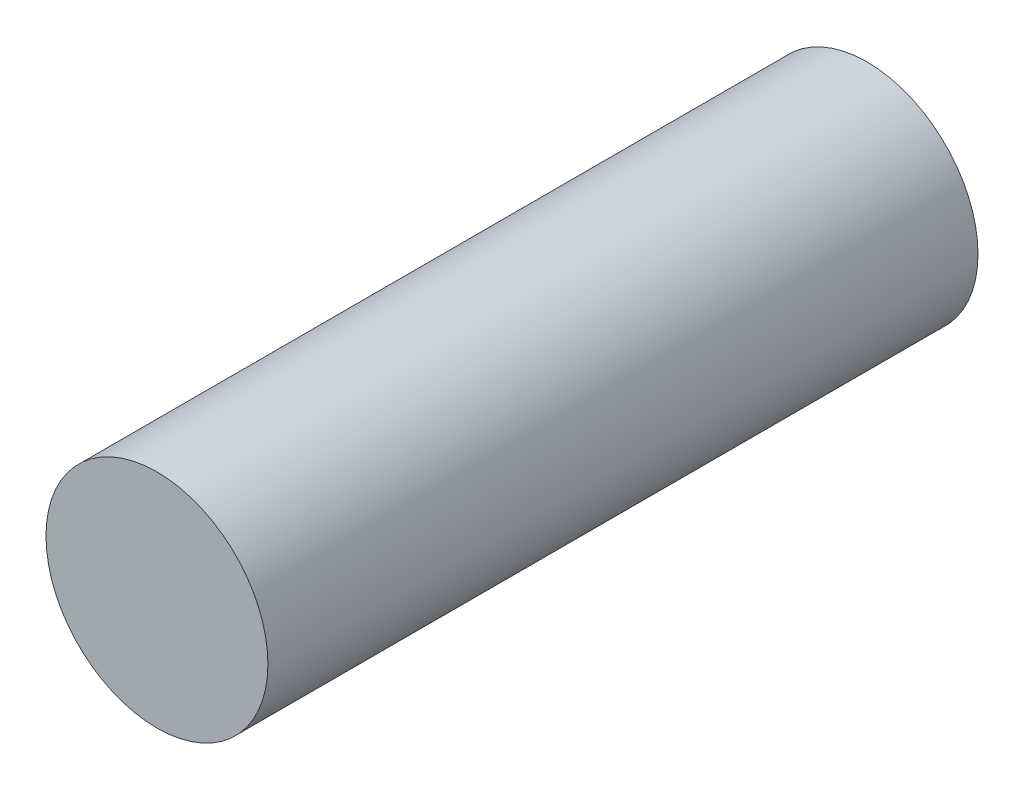
ISO-10303-21;
HEADER;
FILE_DESCRIPTION(('STEP AP214'),'2;1');
FILE_NAME('part.step','',(''),(''),'','','');
FILE_SCHEMA(('AUTOMOTIVE_DESIGN { 1 0 10303 214 1 1 1 1 }'));
ENDSEC;
DATA;
#1=APPLICATION_CONTEXT('core data for automotive mechanical design processes');
#2=APPLICATION_PROTOCOL_DEFINITION('international standard','automotive_design',2000,#1);
#3=PRODUCT_CONTEXT('',#1,'mechanical');
#4=PRODUCT('Part','Part','',(#3));
#5=PRODUCT_RELATED_PRODUCT_CATEGORY('part','',(#4));
#6=PRODUCT_DEFINITION_FORMATION('','',#4);
#7=PRODUCT_DEFINITION_CONTEXT('part definition',#1,'design');
#8=PRODUCT_DEFINITION('design','',#6,#7);
#9=PRODUCT_DEFINITION_SHAPE('','',#8);
#10=(LENGTH_UNIT() NAMED_UNIT(*) SI_UNIT(.MILLI.,.METRE.));
#11=(NAMED_UNIT(*) PLANE_ANGLE_UNIT() SI_UNIT($,.RADIAN.));
#12=(NAMED_UNIT(*) SI_UNIT($,.STERADIAN.) SOLID_ANGLE_UNIT());
#13=UNCERTAINTY_MEASURE_WITH_UNIT(LENGTH_MEASURE(1.E-05),#10,'distance_accuracy_value','');
#14=(GEOMETRIC_REPRESENTATION_CONTEXT(3) GLOBAL_UNCERTAINTY_ASSIGNED_CONTEXT((#13)) GLOBAL_UNIT_ASSIGNED_CONTEXT((#10,
#11,#12)) REPRESENTATION_CONTEXT('',''));
#15=CARTESIAN_POINT('',(0.,0.,0.));
#16=DIRECTION('',(0.,0.,1.));
#17=DIRECTION('',(1.,0.,0.));
#18=AXIS2_PLACEMENT_3D('',#15,#16,#17);
#19=CARTESIAN_POINT('',(0.,0.,-24.));
#20=DIRECTION('',(0.,0.,1.));
#21=DIRECTION('',(1.,0.,0.));
#22=AXIS2_PLACEMENT_3D('',#19,#20,#21);
#23=CYLINDRICAL_SURFACE('',#22,3.75);
#24=CARTESIAN_POINT('',(0.,0.,-24.));
#25=DIRECTION('',(0.,0.,1.));
#26=DIRECTION('',(1.,0.,0.));
#27=AXIS2_PLACEMENT_3D('',#24,#25,#26);
#28=CIRCLE('',#27,3.75);
#29=CARTESIAN_POINT('',(3.75,0.,-24.));
#30=VERTEX_POINT('',#29);
#31=EDGE_CURVE('E10',#30,#30,#28,.T.);
#32=ORIENTED_EDGE('',*,*,#31,.T.);
#33=EDGE_LOOP('',(#32));
#34=FACE_BOUND('',#33,.T.);
#35=CARTESIAN_POINT('',(0.,0.,0.));
#36=DIRECTION('',(0.,0.,1.));
#37=DIRECTION('',(1.,0.,0.));
#38=AXIS2_PLACEMENT_3D('',#35,#36,#37);
#39=CIRCLE('',#38,3.75);
#40=CARTESIAN_POINT('',(3.75,0.,0.));
#41=VERTEX_POINT('',#40);
#42=EDGE_CURVE('E42',#41,#41,#39,.T.);
#43=ORIENTED_EDGE('',*,*,#42,.F.);
#44=EDGE_LOOP('',(#43));
#45=FACE_BOUND('',#44,.T.);
#46=ADVANCED_FACE('F39',(#34,#45),#23,.T.);
#47=CARTESIAN_POINT('',(0.,0.,-24.));
#48=DIRECTION('',(0.,0.,1.));
#49=DIRECTION('',(1.,0.,0.));
#50=AXIS2_PLACEMENT_3D('',#47,#48,#49);
#51=PLANE('',#50);
#52=ORIENTED_EDGE('',*,*,#31,.F.);
#53=EDGE_LOOP('',(#52));
#54=FACE_BOUND('',#53,.T.);
#55=ADVANCED_FACE('F56',(#54),#51,.F.);
#56=CARTESIAN_POINT('',(0.,0.,0.));
#57=DIRECTION('',(0.,0.,1.));
#58=DIRECTION('',(1.,0.,0.));
#59=AXIS2_PLACEMENT_3D('',#56,#57,#58);
#60=PLANE('',#59);
#61=ORIENTED_EDGE('',*,*,#42,.T.);
#62=EDGE_LOOP('',(#61));
#63=FACE_BOUND('',#62,.T.);
#64=ADVANCED_FACE('F53',(#63),#60,.T.);
#65=CLOSED_SHELL('',(#46,#55,#64));
#66=MANIFOLD_SOLID_BREP('B2',#65);
#67=ADVANCED_BREP_SHAPE_REPRESENTATION('',(#18,#66),#14);
#68=SHAPE_DEFINITION_REPRESENTATION(#9,#67);
ENDSEC;
END-ISO-10303-21;
